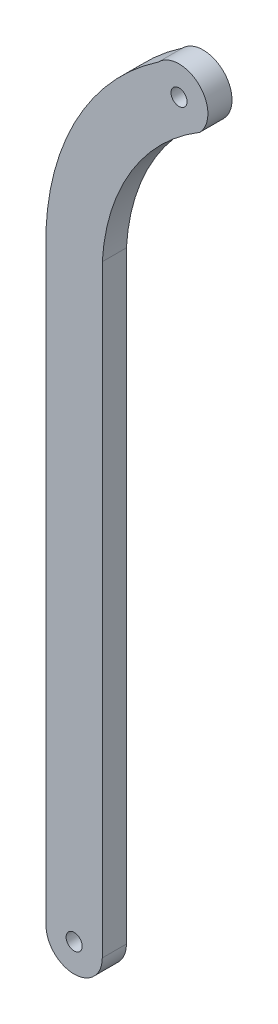
ISO-10303-21;
HEADER;
FILE_DESCRIPTION(('STEP AP214'),'2;1');
FILE_NAME('part.step','',(''),(''),'','','');
FILE_SCHEMA(('AUTOMOTIVE_DESIGN { 1 0 10303 214 1 1 1 1 }'));
ENDSEC;
DATA;
#1=APPLICATION_CONTEXT('core data for automotive mechanical design processes');
#2=APPLICATION_PROTOCOL_DEFINITION('international standard','automotive_design',2000,#1);
#3=PRODUCT_CONTEXT('',#1,'mechanical');
#4=PRODUCT('Part','Part','',(#3));
#5=PRODUCT_RELATED_PRODUCT_CATEGORY('part','',(#4));
#6=PRODUCT_DEFINITION_FORMATION('','',#4);
#7=PRODUCT_DEFINITION_CONTEXT('part definition',#1,'design');
#8=PRODUCT_DEFINITION('design','',#6,#7);
#9=PRODUCT_DEFINITION_SHAPE('','',#8);
#10=(LENGTH_UNIT() NAMED_UNIT(*) SI_UNIT(.MILLI.,.METRE.));
#11=(NAMED_UNIT(*) PLANE_ANGLE_UNIT() SI_UNIT($,.RADIAN.));
#12=(NAMED_UNIT(*) SI_UNIT($,.STERADIAN.) SOLID_ANGLE_UNIT());
#13=UNCERTAINTY_MEASURE_WITH_UNIT(LENGTH_MEASURE(1.E-05),#10,'distance_accuracy_value','');
#14=(GEOMETRIC_REPRESENTATION_CONTEXT(3) GLOBAL_UNCERTAINTY_ASSIGNED_CONTEXT((#13)) GLOBAL_UNIT_ASSIGNED_CONTEXT((#10,
#11,#12)) REPRESENTATION_CONTEXT('',''));
#15=CARTESIAN_POINT('',(0.,0.,0.));
#16=DIRECTION('',(0.,0.,1.));
#17=DIRECTION('',(1.,0.,0.));
#18=AXIS2_PLACEMENT_3D('',#15,#16,#17);
#19=CARTESIAN_POINT('',(3.5,-30.4077994284848,3.));
#20=DIRECTION('',(0.,0.,-1.));
#21=DIRECTION('',(-1.,0.,0.));
#22=AXIS2_PLACEMENT_3D('',#19,#20,#21);
#23=CYLINDRICAL_SURFACE('',#22,3.5);
#24=CARTESIAN_POINT('',(3.5,-30.4077994284848,0.));
#25=DIRECTION('',(0.,0.,1.));
#26=DIRECTION('',(1.,0.,0.));
#27=AXIS2_PLACEMENT_3D('',#24,#25,#26);
#28=CIRCLE('',#27,3.5);
#29=CARTESIAN_POINT('',(0.,-30.4077994284848,0.));
#30=VERTEX_POINT('',#29);
#31=CARTESIAN_POINT('',(7.,-30.4077994284848,0.));
#32=VERTEX_POINT('',#31);
#33=EDGE_CURVE('E115',#30,#32,#28,.T.);
#34=ORIENTED_EDGE('',*,*,#33,.T.);
#35=DIRECTION('',(0.,0.,-1.));
#36=VECTOR('',#35,1.);
#37=CARTESIAN_POINT('',(7.,-30.4077994284848,3.));
#38=LINE('',#37,#36);
#39=CARTESIAN_POINT('',(7.,-30.4077994284848,3.));
#40=VERTEX_POINT('',#39);
#41=EDGE_CURVE('E11',#40,#32,#38,.T.);
#42=ORIENTED_EDGE('',*,*,#41,.F.);
#43=CARTESIAN_POINT('',(3.5,-30.4077994284848,3.));
#44=DIRECTION('',(0.,0.,1.));
#45=DIRECTION('',(1.,0.,0.));
#46=AXIS2_PLACEMENT_3D('',#43,#44,#45);
#47=CIRCLE('',#46,3.5);
#48=CARTESIAN_POINT('',(0.,-30.4077994284848,3.));
#49=VERTEX_POINT('',#48);
#50=EDGE_CURVE('E128',#49,#40,#47,.T.);
#51=ORIENTED_EDGE('',*,*,#50,.F.);
#52=DIRECTION('',(0.,0.,-1.));
#53=VECTOR('',#52,1.);
#54=CARTESIAN_POINT('',(0.,-30.4077994284848,3.));
#55=LINE('',#54,#53);
#56=EDGE_CURVE('E111',#49,#30,#55,.T.);
#57=ORIENTED_EDGE('',*,*,#56,.T.);
#58=EDGE_LOOP('',(#34,#42,#51,#57));
#59=FACE_BOUND('',#58,.T.);
#60=ADVANCED_FACE('F33',(#59),#23,.T.);
#61=CARTESIAN_POINT('',(7.,-30.4077994284848,3.));
#62=DIRECTION('',(-1.,0.,0.));
#63=DIRECTION('',(0.,0.,1.));
#64=AXIS2_PLACEMENT_3D('',#61,#62,#63);
#65=PLANE('',#64);
#66=DIRECTION('',(0.,1.,0.));
#67=VECTOR('',#66,1.);
#68=CARTESIAN_POINT('',(7.,-30.4077994284848,0.));
#69=LINE('',#68,#67);
#70=CARTESIAN_POINT('',(7.,44.5922005715152,0.));
#71=VERTEX_POINT('',#70);
#72=EDGE_CURVE('E118',#32,#71,#69,.T.);
#73=ORIENTED_EDGE('',*,*,#72,.T.);
#74=DIRECTION('',(0.,0.,-1.));
#75=VECTOR('',#74,1.);
#76=CARTESIAN_POINT('',(7.,44.5922005715152,3.));
#77=LINE('',#76,#75);
#78=CARTESIAN_POINT('',(7.,44.5922005715152,3.));
#79=VERTEX_POINT('',#78);
#80=EDGE_CURVE('E41',#79,#71,#77,.T.);
#81=ORIENTED_EDGE('',*,*,#80,.F.);
#82=DIRECTION('',(0.,1.,0.));
#83=VECTOR('',#82,1.);
#84=CARTESIAN_POINT('',(7.,-30.4077994284848,3.));
#85=LINE('',#84,#83);
#86=EDGE_CURVE('E82',#40,#79,#85,.T.);
#87=ORIENTED_EDGE('',*,*,#86,.F.);
#88=ORIENTED_EDGE('',*,*,#41,.T.);
#89=EDGE_LOOP('',(#73,#81,#87,#88));
#90=FACE_BOUND('',#89,.T.);
#91=ADVANCED_FACE('F153',(#90),#65,.F.);
#92=CARTESIAN_POINT('',(31.9577135816552,43.1387451108757,3.));
#93=DIRECTION('',(0.,0.,-1.));
#94=DIRECTION('',(-1.,0.,0.));
#95=AXIS2_PLACEMENT_3D('',#92,#93,#94);
#96=CYLINDRICAL_SURFACE('',#95,25.);
#97=CARTESIAN_POINT('',(31.9577135816552,43.1387451108757,0.));
#98=DIRECTION('',(0.,0.,-1.));
#99=DIRECTION('',(-1.,0.,0.));
#100=AXIS2_PLACEMENT_3D('',#97,#98,#99);
#101=CIRCLE('',#100,25.);
#102=CARTESIAN_POINT('',(19.1222451913566,64.5922005715152,0.));
#103=VERTEX_POINT('',#102);
#104=EDGE_CURVE('E121',#71,#103,#101,.T.);
#105=ORIENTED_EDGE('',*,*,#104,.T.);
#106=DIRECTION('',(0.,0.,-1.));
#107=VECTOR('',#106,1.);
#108=CARTESIAN_POINT('',(19.1222451913566,64.5922005715152,3.));
#109=LINE('',#108,#107);
#110=CARTESIAN_POINT('',(19.1222451913566,64.5922005715152,3.));
#111=VERTEX_POINT('',#110);
#112=EDGE_CURVE('E101',#111,#103,#109,.T.);
#113=ORIENTED_EDGE('',*,*,#112,.F.);
#114=CARTESIAN_POINT('',(31.9577135816552,43.1387451108757,3.));
#115=DIRECTION('',(0.,0.,-1.));
#116=DIRECTION('',(-1.,0.,0.));
#117=AXIS2_PLACEMENT_3D('',#114,#115,#116);
#118=CIRCLE('',#117,25.);
#119=EDGE_CURVE('E106',#79,#111,#118,.T.);
#120=ORIENTED_EDGE('',*,*,#119,.F.);
#121=ORIENTED_EDGE('',*,*,#80,.T.);
#122=EDGE_LOOP('',(#105,#113,#120,#121));
#123=FACE_BOUND('',#122,.T.);
#124=ADVANCED_FACE('F134',(#123),#96,.F.);
#125=CARTESIAN_POINT('',(16.545221408451,67.0922005715152,3.));
#126=DIRECTION('',(0.,0.,-1.));
#127=DIRECTION('',(-1.,0.,0.));
#128=AXIS2_PLACEMENT_3D('',#125,#126,#127);
#129=CYLINDRICAL_SURFACE('',#128,3.59041105970629);
#130=CARTESIAN_POINT('',(16.545221408451,67.0922005715152,0.));
#131=DIRECTION('',(0.,0.,-1.));
#132=DIRECTION('',(-1.,0.,0.));
#133=AXIS2_PLACEMENT_3D('',#130,#131,#132);
#134=CIRCLE('',#133,3.59041105970629);
#135=CARTESIAN_POINT('',(13.9681976255454,69.5922005715152,0.));
#136=VERTEX_POINT('',#135);
#137=EDGE_CURVE('E96',#136,#103,#134,.T.);
#138=ORIENTED_EDGE('',*,*,#137,.F.);
#139=DIRECTION('',(0.,0.,-1.));
#140=VECTOR('',#139,1.);
#141=CARTESIAN_POINT('',(13.9681976255454,69.5922005715152,3.));
#142=LINE('',#141,#140);
#143=CARTESIAN_POINT('',(13.9681976255454,69.5922005715152,3.));
#144=VERTEX_POINT('',#143);
#145=EDGE_CURVE('E91',#144,#136,#142,.T.);
#146=ORIENTED_EDGE('',*,*,#145,.F.);
#147=CARTESIAN_POINT('',(16.545221408451,67.0922005715152,3.));
#148=DIRECTION('',(0.,0.,-1.));
#149=DIRECTION('',(-1.,0.,0.));
#150=AXIS2_PLACEMENT_3D('',#147,#148,#149);
#151=CIRCLE('',#150,3.59041105970629);
#152=EDGE_CURVE('E94',#144,#111,#151,.T.);
#153=ORIENTED_EDGE('',*,*,#152,.T.);
#154=ORIENTED_EDGE('',*,*,#112,.T.);
#155=EDGE_LOOP('',(#138,#146,#153,#154));
#156=FACE_BOUND('',#155,.T.);
#157=ADVANCED_FACE('F93',(#156),#129,.T.);
#158=CARTESIAN_POINT('',(31.9577135816552,43.1387451108757,3.));
#159=DIRECTION('',(0.,0.,-1.));
#160=DIRECTION('',(-1.,0.,0.));
#161=AXIS2_PLACEMENT_3D('',#158,#159,#160);
#162=CYLINDRICAL_SURFACE('',#161,31.9907485086419);
#163=CARTESIAN_POINT('',(31.9577135816552,43.1387451108757,0.));
#164=DIRECTION('',(0.,0.,-1.));
#165=DIRECTION('',(-1.,0.,0.));
#166=AXIS2_PLACEMENT_3D('',#163,#164,#165);
#167=CIRCLE('',#166,31.9907485086419);
#168=CARTESIAN_POINT('',(0.,44.5922005715152,0.));
#169=VERTEX_POINT('',#168);
#170=EDGE_CURVE('E125',#169,#136,#167,.T.);
#171=ORIENTED_EDGE('',*,*,#170,.F.);
#172=DIRECTION('',(0.,0.,-1.));
#173=VECTOR('',#172,1.);
#174=CARTESIAN_POINT('',(0.,44.5922005715152,3.));
#175=LINE('',#174,#173);
#176=CARTESIAN_POINT('',(0.,44.5922005715152,3.));
#177=VERTEX_POINT('',#176);
#178=EDGE_CURVE('E71',#177,#169,#175,.T.);
#179=ORIENTED_EDGE('',*,*,#178,.F.);
#180=CARTESIAN_POINT('',(31.9577135816552,43.1387451108757,3.));
#181=DIRECTION('',(0.,0.,-1.));
#182=DIRECTION('',(-1.,0.,0.));
#183=AXIS2_PLACEMENT_3D('',#180,#181,#182);
#184=CIRCLE('',#183,31.9907485086419);
#185=EDGE_CURVE('E104',#177,#144,#184,.T.);
#186=ORIENTED_EDGE('',*,*,#185,.T.);
#187=ORIENTED_EDGE('',*,*,#145,.T.);
#188=EDGE_LOOP('',(#171,#179,#186,#187));
#189=FACE_BOUND('',#188,.T.);
#190=ADVANCED_FACE('F109',(#189),#162,.T.);
#191=CARTESIAN_POINT('',(0.,44.5922005715152,3.));
#192=DIRECTION('',(1.,0.,0.));
#193=DIRECTION('',(0.,0.,-1.));
#194=AXIS2_PLACEMENT_3D('',#191,#192,#193);
#195=PLANE('',#194);
#196=DIRECTION('',(0.,-1.,0.));
#197=VECTOR('',#196,1.);
#198=CARTESIAN_POINT('',(0.,44.5922005715152,0.));
#199=LINE('',#198,#197);
#200=EDGE_CURVE('E74',#169,#30,#199,.T.);
#201=ORIENTED_EDGE('',*,*,#200,.T.);
#202=ORIENTED_EDGE('',*,*,#56,.F.);
#203=DIRECTION('',(0.,-1.,0.));
#204=VECTOR('',#203,1.);
#205=CARTESIAN_POINT('',(0.,44.5922005715152,3.));
#206=LINE('',#205,#204);
#207=EDGE_CURVE('E49',#177,#49,#206,.T.);
#208=ORIENTED_EDGE('',*,*,#207,.F.);
#209=ORIENTED_EDGE('',*,*,#178,.T.);
#210=EDGE_LOOP('',(#201,#202,#208,#209));
#211=FACE_BOUND('',#210,.T.);
#212=ADVANCED_FACE('F141',(#211),#195,.F.);
#213=CARTESIAN_POINT('',(3.5,-30.4077994284848,3.));
#214=DIRECTION('',(0.,0.,1.));
#215=DIRECTION('',(1.,0.,0.));
#216=AXIS2_PLACEMENT_3D('',#213,#214,#215);
#217=PLANE('',#216);
#218=CARTESIAN_POINT('',(3.5,-30.4077994284848,3.));
#219=DIRECTION('',(0.,0.,1.));
#220=DIRECTION('',(1.,0.,0.));
#221=AXIS2_PLACEMENT_3D('',#218,#219,#220);
#222=CIRCLE('',#221,1.);
#223=CARTESIAN_POINT('',(4.5,-30.4077994284848,3.));
#224=VERTEX_POINT('',#223);
#225=EDGE_CURVE('E219',#224,#224,#222,.T.);
#226=ORIENTED_EDGE('',*,*,#225,.F.);
#227=EDGE_LOOP('',(#226));
#228=FACE_BOUND('',#227,.T.);
#229=CARTESIAN_POINT('',(16.545221408451,67.0922005715152,3.));
#230=DIRECTION('',(0.,0.,1.));
#231=DIRECTION('',(1.,0.,0.));
#232=AXIS2_PLACEMENT_3D('',#229,#230,#231);
#233=CIRCLE('',#232,1.);
#234=CARTESIAN_POINT('',(17.545221408451,67.0922005715152,3.));
#235=VERTEX_POINT('',#234);
#236=EDGE_CURVE('E221',#235,#235,#233,.T.);
#237=ORIENTED_EDGE('',*,*,#236,.F.);
#238=EDGE_LOOP('',(#237));
#239=FACE_BOUND('',#238,.T.);
#240=ORIENTED_EDGE('',*,*,#50,.T.);
#241=ORIENTED_EDGE('',*,*,#86,.T.);
#242=ORIENTED_EDGE('',*,*,#119,.T.);
#243=ORIENTED_EDGE('',*,*,#152,.F.);
#244=ORIENTED_EDGE('',*,*,#185,.F.);
#245=ORIENTED_EDGE('',*,*,#207,.T.);
#246=EDGE_LOOP('',(#240,#241,#242,#243,#244,#245));
#247=FACE_BOUND('',#246,.T.);
#248=ADVANCED_FACE('F103',(#228,#239,#247),#217,.T.);
#249=CARTESIAN_POINT('',(3.5,-30.4077994284848,0.));
#250=DIRECTION('',(0.,0.,1.));
#251=DIRECTION('',(1.,0.,0.));
#252=AXIS2_PLACEMENT_3D('',#249,#250,#251);
#253=PLANE('',#252);
#254=CARTESIAN_POINT('',(3.5,-30.4077994284848,0.));
#255=DIRECTION('',(0.,0.,1.));
#256=DIRECTION('',(1.,0.,0.));
#257=AXIS2_PLACEMENT_3D('',#254,#255,#256);
#258=CIRCLE('',#257,1.);
#259=CARTESIAN_POINT('',(4.5,-30.4077994284848,0.));
#260=VERTEX_POINT('',#259);
#261=EDGE_CURVE('E216',#260,#260,#258,.T.);
#262=ORIENTED_EDGE('',*,*,#261,.T.);
#263=EDGE_LOOP('',(#262));
#264=FACE_BOUND('',#263,.T.);
#265=CARTESIAN_POINT('',(16.545221408451,67.0922005715152,0.));
#266=DIRECTION('',(0.,0.,1.));
#267=DIRECTION('',(1.,0.,0.));
#268=AXIS2_PLACEMENT_3D('',#265,#266,#267);
#269=CIRCLE('',#268,1.);
#270=CARTESIAN_POINT('',(17.545221408451,67.0922005715152,0.));
#271=VERTEX_POINT('',#270);
#272=EDGE_CURVE('E119',#271,#271,#269,.T.);
#273=ORIENTED_EDGE('',*,*,#272,.T.);
#274=EDGE_LOOP('',(#273));
#275=FACE_BOUND('',#274,.T.);
#276=ORIENTED_EDGE('',*,*,#33,.F.);
#277=ORIENTED_EDGE('',*,*,#200,.F.);
#278=ORIENTED_EDGE('',*,*,#170,.T.);
#279=ORIENTED_EDGE('',*,*,#137,.T.);
#280=ORIENTED_EDGE('',*,*,#104,.F.);
#281=ORIENTED_EDGE('',*,*,#72,.F.);
#282=EDGE_LOOP('',(#276,#277,#278,#279,#280,#281));
#283=FACE_BOUND('',#282,.T.);
#284=ADVANCED_FACE('F137',(#264,#275,#283),#253,.F.);
#285=CARTESIAN_POINT('',(16.545221408451,67.0922005715152,3.));
#286=DIRECTION('',(0.,0.,1.));
#287=DIRECTION('',(1.,0.,0.));
#288=AXIS2_PLACEMENT_3D('',#285,#286,#287);
#289=CYLINDRICAL_SURFACE('',#288,1.);
#290=ORIENTED_EDGE('',*,*,#272,.F.);
#291=EDGE_LOOP('',(#290));
#292=FACE_BOUND('',#291,.T.);
#293=ORIENTED_EDGE('',*,*,#236,.T.);
#294=EDGE_LOOP('',(#293));
#295=FACE_BOUND('',#294,.T.);
#296=ADVANCED_FACE('F181',(#292,#295),#289,.F.);
#297=CARTESIAN_POINT('',(3.5,-30.4077994284848,3.));
#298=DIRECTION('',(0.,0.,1.));
#299=DIRECTION('',(1.,0.,0.));
#300=AXIS2_PLACEMENT_3D('',#297,#298,#299);
#301=CYLINDRICAL_SURFACE('',#300,1.);
#302=ORIENTED_EDGE('',*,*,#261,.F.);
#303=EDGE_LOOP('',(#302));
#304=FACE_BOUND('',#303,.T.);
#305=ORIENTED_EDGE('',*,*,#225,.T.);
#306=EDGE_LOOP('',(#305));
#307=FACE_BOUND('',#306,.T.);
#308=ADVANCED_FACE('F186',(#304,#307),#301,.F.);
#309=CLOSED_SHELL('',(#60,#91,#124,#157,#190,#212,#248,#284,#296,#308));
#310=MANIFOLD_SOLID_BREP('B2',#309);
#311=ADVANCED_BREP_SHAPE_REPRESENTATION('',(#18,#310),#14);
#312=SHAPE_DEFINITION_REPRESENTATION(#9,#311);
ENDSEC;
END-ISO-10303-21;
